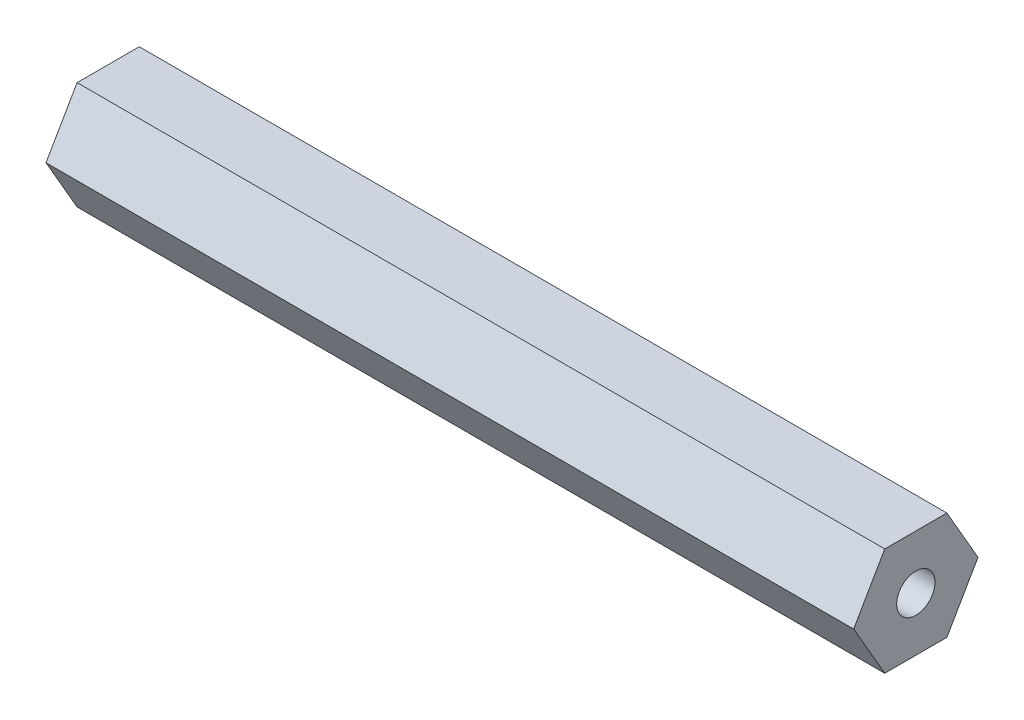
ISO-10303-21;
HEADER;
FILE_DESCRIPTION(('STEP AP214'),'2;1');
FILE_NAME('part.step','',(''),(''),'','','');
FILE_SCHEMA(('AUTOMOTIVE_DESIGN { 1 0 10303 214 1 1 1 1 }'));
ENDSEC;
DATA;
#1=APPLICATION_CONTEXT('core data for automotive mechanical design processes');
#2=APPLICATION_PROTOCOL_DEFINITION('international standard','automotive_design',2000,#1);
#3=PRODUCT_CONTEXT('',#1,'mechanical');
#4=PRODUCT('Part','Part','',(#3));
#5=PRODUCT_RELATED_PRODUCT_CATEGORY('part','',(#4));
#6=PRODUCT_DEFINITION_FORMATION('','',#4);
#7=PRODUCT_DEFINITION_CONTEXT('part definition',#1,'design');
#8=PRODUCT_DEFINITION('design','',#6,#7);
#9=PRODUCT_DEFINITION_SHAPE('','',#8);
#10=(LENGTH_UNIT() NAMED_UNIT(*) SI_UNIT(.MILLI.,.METRE.));
#11=(NAMED_UNIT(*) PLANE_ANGLE_UNIT() SI_UNIT($,.RADIAN.));
#12=(NAMED_UNIT(*) SI_UNIT($,.STERADIAN.) SOLID_ANGLE_UNIT());
#13=UNCERTAINTY_MEASURE_WITH_UNIT(LENGTH_MEASURE(1.E-05),#10,'distance_accuracy_value','');
#14=(GEOMETRIC_REPRESENTATION_CONTEXT(3) GLOBAL_UNCERTAINTY_ASSIGNED_CONTEXT((#13)) GLOBAL_UNIT_ASSIGNED_CONTEXT((#10,
#11,#12)) REPRESENTATION_CONTEXT('',''));
#15=CARTESIAN_POINT('',(0.,0.,0.));
#16=DIRECTION('',(0.,0.,1.));
#17=DIRECTION('',(1.,0.,0.));
#18=AXIS2_PLACEMENT_3D('',#15,#16,#17);
#19=CARTESIAN_POINT('',(-47.625,-3.175,-1.83308710467706));
#20=DIRECTION('',(0.,-0.5,-0.866025403784439));
#21=DIRECTION('',(0.,0.866025403784439,-0.5));
#22=AXIS2_PLACEMENT_3D('',#19,#20,#21);
#23=PLANE('',#22);
#24=DIRECTION('',(0.,0.866025403784439,-0.5));
#25=VECTOR('',#24,1.);
#26=CARTESIAN_POINT('',(0.,-3.175,-1.83308710467706));
#27=LINE('',#26,#25);
#28=CARTESIAN_POINT('',(0.,-3.175,-1.83308710467706));
#29=VERTEX_POINT('',#28);
#30=CARTESIAN_POINT('',(0.,0.,-3.66617420935412));
#31=VERTEX_POINT('',#30);
#32=EDGE_CURVE('E114',#29,#31,#27,.T.);
#33=ORIENTED_EDGE('',*,*,#32,.F.);
#34=DIRECTION('',(1.,0.,0.));
#35=VECTOR('',#34,1.);
#36=CARTESIAN_POINT('',(-47.625,-3.175,-1.83308710467706));
#37=LINE('',#36,#35);
#38=CARTESIAN_POINT('',(-47.625,-3.175,-1.83308710467706));
#39=VERTEX_POINT('',#38);
#40=EDGE_CURVE('E11',#39,#29,#37,.T.);
#41=ORIENTED_EDGE('',*,*,#40,.F.);
#42=DIRECTION('',(0.,0.866025403784439,-0.5));
#43=VECTOR('',#42,1.);
#44=CARTESIAN_POINT('',(-47.625,-3.175,-1.83308710467706));
#45=LINE('',#44,#43);
#46=CARTESIAN_POINT('',(-47.625,0.,-3.66617420935412));
#47=VERTEX_POINT('',#46);
#48=EDGE_CURVE('E132',#39,#47,#45,.T.);
#49=ORIENTED_EDGE('',*,*,#48,.T.);
#50=DIRECTION('',(1.,0.,0.));
#51=VECTOR('',#50,1.);
#52=CARTESIAN_POINT('',(-47.625,0.,-3.66617420935412));
#53=LINE('',#52,#51);
#54=EDGE_CURVE('E39',#47,#31,#53,.T.);
#55=ORIENTED_EDGE('',*,*,#54,.T.);
#56=EDGE_LOOP('',(#33,#41,#49,#55));
#57=FACE_BOUND('',#56,.T.);
#58=ADVANCED_FACE('F36',(#57),#23,.T.);
#59=CARTESIAN_POINT('',(-47.625,-3.175,1.83308710467706));
#60=DIRECTION('',(0.,-1.,0.));
#61=DIRECTION('',(0.,0.,-1.));
#62=AXIS2_PLACEMENT_3D('',#59,#60,#61);
#63=PLANE('',#62);
#64=DIRECTION('',(0.,0.,-1.));
#65=VECTOR('',#64,1.);
#66=CARTESIAN_POINT('',(0.,-3.175,1.83308710467706));
#67=LINE('',#66,#65);
#68=CARTESIAN_POINT('',(0.,-3.175,1.83308710467706));
#69=VERTEX_POINT('',#68);
#70=EDGE_CURVE('E129',#69,#29,#67,.T.);
#71=ORIENTED_EDGE('',*,*,#70,.F.);
#72=DIRECTION('',(1.,0.,0.));
#73=VECTOR('',#72,1.);
#74=CARTESIAN_POINT('',(-47.625,-3.175,1.83308710467706));
#75=LINE('',#74,#73);
#76=CARTESIAN_POINT('',(-47.625,-3.175,1.83308710467706));
#77=VERTEX_POINT('',#76);
#78=EDGE_CURVE('E44',#77,#69,#75,.T.);
#79=ORIENTED_EDGE('',*,*,#78,.F.);
#80=DIRECTION('',(0.,0.,-1.));
#81=VECTOR('',#80,1.);
#82=CARTESIAN_POINT('',(-47.625,-3.175,1.83308710467706));
#83=LINE('',#82,#81);
#84=EDGE_CURVE('E145',#77,#39,#83,.T.);
#85=ORIENTED_EDGE('',*,*,#84,.T.);
#86=ORIENTED_EDGE('',*,*,#40,.T.);
#87=EDGE_LOOP('',(#71,#79,#85,#86));
#88=FACE_BOUND('',#87,.T.);
#89=ADVANCED_FACE('F160',(#88),#63,.T.);
#90=CARTESIAN_POINT('',(-47.625,0.,3.66617420935412));
#91=DIRECTION('',(0.,-0.5,0.866025403784438));
#92=DIRECTION('',(0.,-0.866025403784439,-0.5));
#93=AXIS2_PLACEMENT_3D('',#90,#91,#92);
#94=PLANE('',#93);
#95=DIRECTION('',(0.,-0.866025403784438,-0.5));
#96=VECTOR('',#95,1.);
#97=CARTESIAN_POINT('',(0.,0.,3.66617420935412));
#98=LINE('',#97,#96);
#99=CARTESIAN_POINT('',(0.,0.,3.66617420935412));
#100=VERTEX_POINT('',#99);
#101=EDGE_CURVE('E126',#100,#69,#98,.T.);
#102=ORIENTED_EDGE('',*,*,#101,.F.);
#103=DIRECTION('',(1.,0.,0.));
#104=VECTOR('',#103,1.);
#105=CARTESIAN_POINT('',(-47.625,0.,3.66617420935412));
#106=LINE('',#105,#104);
#107=CARTESIAN_POINT('',(-47.625,0.,3.66617420935412));
#108=VERTEX_POINT('',#107);
#109=EDGE_CURVE('E148',#108,#100,#106,.T.);
#110=ORIENTED_EDGE('',*,*,#109,.F.);
#111=DIRECTION('',(0.,-0.866025403784438,-0.5));
#112=VECTOR('',#111,1.);
#113=CARTESIAN_POINT('',(-47.625,0.,3.66617420935412));
#114=LINE('',#113,#112);
#115=EDGE_CURVE('E143',#108,#77,#114,.T.);
#116=ORIENTED_EDGE('',*,*,#115,.T.);
#117=ORIENTED_EDGE('',*,*,#78,.T.);
#118=EDGE_LOOP('',(#102,#110,#116,#117));
#119=FACE_BOUND('',#118,.T.);
#120=ADVANCED_FACE('F173',(#119),#94,.T.);
#121=CARTESIAN_POINT('',(-47.625,3.175,1.83308710467706));
#122=DIRECTION('',(0.,0.5,0.866025403784438));
#123=DIRECTION('',(0.,-0.866025403784439,0.5));
#124=AXIS2_PLACEMENT_3D('',#121,#122,#123);
#125=PLANE('',#124);
#126=DIRECTION('',(0.,-0.866025403784438,0.5));
#127=VECTOR('',#126,1.);
#128=CARTESIAN_POINT('',(0.,3.175,1.83308710467706));
#129=LINE('',#128,#127);
#130=CARTESIAN_POINT('',(0.,3.175,1.83308710467706));
#131=VERTEX_POINT('',#130);
#132=EDGE_CURVE('E123',#131,#100,#129,.T.);
#133=ORIENTED_EDGE('',*,*,#132,.F.);
#134=DIRECTION('',(1.,0.,0.));
#135=VECTOR('',#134,1.);
#136=CARTESIAN_POINT('',(-47.625,3.175,1.83308710467706));
#137=LINE('',#136,#135);
#138=CARTESIAN_POINT('',(-47.625,3.175,1.83308710467706));
#139=VERTEX_POINT('',#138);
#140=EDGE_CURVE('E150',#139,#131,#137,.T.);
#141=ORIENTED_EDGE('',*,*,#140,.F.);
#142=DIRECTION('',(0.,-0.866025403784438,0.5));
#143=VECTOR('',#142,1.);
#144=CARTESIAN_POINT('',(-47.625,3.175,1.83308710467706));
#145=LINE('',#144,#143);
#146=EDGE_CURVE('E140',#139,#108,#145,.T.);
#147=ORIENTED_EDGE('',*,*,#146,.T.);
#148=ORIENTED_EDGE('',*,*,#109,.T.);
#149=EDGE_LOOP('',(#133,#141,#147,#148));
#150=FACE_BOUND('',#149,.T.);
#151=ADVANCED_FACE('F171',(#150),#125,.T.);
#152=CARTESIAN_POINT('',(-47.625,3.175,-1.83308710467706));
#153=DIRECTION('',(0.,1.,0.));
#154=DIRECTION('',(0.,0.,1.));
#155=AXIS2_PLACEMENT_3D('',#152,#153,#154);
#156=PLANE('',#155);
#157=DIRECTION('',(0.,0.,1.));
#158=VECTOR('',#157,1.);
#159=CARTESIAN_POINT('',(0.,3.175,-1.83308710467706));
#160=LINE('',#159,#158);
#161=CARTESIAN_POINT('',(0.,3.175,-1.83308710467706));
#162=VERTEX_POINT('',#161);
#163=EDGE_CURVE('E120',#162,#131,#160,.T.);
#164=ORIENTED_EDGE('',*,*,#163,.F.);
#165=DIRECTION('',(1.,0.,0.));
#166=VECTOR('',#165,1.);
#167=CARTESIAN_POINT('',(-47.625,3.175,-1.83308710467706));
#168=LINE('',#167,#166);
#169=CARTESIAN_POINT('',(-47.625,3.175,-1.83308710467706));
#170=VERTEX_POINT('',#169);
#171=EDGE_CURVE('E151',#170,#162,#168,.T.);
#172=ORIENTED_EDGE('',*,*,#171,.F.);
#173=DIRECTION('',(0.,0.,1.));
#174=VECTOR('',#173,1.);
#175=CARTESIAN_POINT('',(-47.625,3.175,-1.83308710467706));
#176=LINE('',#175,#174);
#177=EDGE_CURVE('E137',#170,#139,#176,.T.);
#178=ORIENTED_EDGE('',*,*,#177,.T.);
#179=ORIENTED_EDGE('',*,*,#140,.T.);
#180=EDGE_LOOP('',(#164,#172,#178,#179));
#181=FACE_BOUND('',#180,.T.);
#182=ADVANCED_FACE('F168',(#181),#156,.T.);
#183=CARTESIAN_POINT('',(-47.625,0.,-3.66617420935412));
#184=DIRECTION('',(0.,0.5,-0.866025403784438));
#185=DIRECTION('',(0.,0.866025403784438,0.5));
#186=AXIS2_PLACEMENT_3D('',#183,#184,#185);
#187=PLANE('',#186);
#188=DIRECTION('',(0.,0.866025403784438,0.5));
#189=VECTOR('',#188,1.);
#190=CARTESIAN_POINT('',(0.,0.,-3.66617420935412));
#191=LINE('',#190,#189);
#192=EDGE_CURVE('E117',#31,#162,#191,.T.);
#193=ORIENTED_EDGE('',*,*,#192,.F.);
#194=ORIENTED_EDGE('',*,*,#54,.F.);
#195=DIRECTION('',(0.,0.866025403784438,0.5));
#196=VECTOR('',#195,1.);
#197=CARTESIAN_POINT('',(-47.625,0.,-3.66617420935412));
#198=LINE('',#197,#196);
#199=EDGE_CURVE('E134',#47,#170,#198,.T.);
#200=ORIENTED_EDGE('',*,*,#199,.T.);
#201=ORIENTED_EDGE('',*,*,#171,.T.);
#202=EDGE_LOOP('',(#193,#194,#200,#201));
#203=FACE_BOUND('',#202,.T.);
#204=ADVANCED_FACE('F156',(#203),#187,.T.);
#205=CARTESIAN_POINT('',(-47.625,0.,-3.66617420935412));
#206=DIRECTION('',(1.,0.,0.));
#207=DIRECTION('',(0.,0.,-1.));
#208=AXIS2_PLACEMENT_3D('',#205,#206,#207);
#209=PLANE('',#208);
#210=CARTESIAN_POINT('',(-47.625,0.,0.));
#211=DIRECTION('',(-1.,0.,0.));
#212=DIRECTION('',(0.,0.,1.));
#213=AXIS2_PLACEMENT_3D('',#210,#211,#212);
#214=CIRCLE('',#213,1.13029999999999);
#215=CARTESIAN_POINT('',(-47.625,0.,1.13029999999999));
#216=VERTEX_POINT('',#215);
#217=EDGE_CURVE('E104',#216,#216,#214,.T.);
#218=ORIENTED_EDGE('',*,*,#217,.F.);
#219=EDGE_LOOP('',(#218));
#220=FACE_BOUND('',#219,.T.);
#221=ORIENTED_EDGE('',*,*,#48,.F.);
#222=ORIENTED_EDGE('',*,*,#84,.F.);
#223=ORIENTED_EDGE('',*,*,#115,.F.);
#224=ORIENTED_EDGE('',*,*,#146,.F.);
#225=ORIENTED_EDGE('',*,*,#177,.F.);
#226=ORIENTED_EDGE('',*,*,#199,.F.);
#227=EDGE_LOOP('',(#221,#222,#223,#224,#225,#226));
#228=FACE_BOUND('',#227,.T.);
#229=ADVANCED_FACE('F164',(#220,#228),#209,.F.);
#230=CARTESIAN_POINT('',(0.,0.,-3.66617420935412));
#231=DIRECTION('',(1.,0.,0.));
#232=DIRECTION('',(0.,0.,-1.));
#233=AXIS2_PLACEMENT_3D('',#230,#231,#232);
#234=PLANE('',#233);
#235=CARTESIAN_POINT('',(0.,0.,0.));
#236=DIRECTION('',(1.,0.,0.));
#237=DIRECTION('',(0.,0.,-1.));
#238=AXIS2_PLACEMENT_3D('',#235,#236,#237);
#239=CIRCLE('',#238,1.13029999999999);
#240=CARTESIAN_POINT('',(0.,0.,-1.13029999999999));
#241=VERTEX_POINT('',#240);
#242=EDGE_CURVE('E107',#241,#241,#239,.T.);
#243=ORIENTED_EDGE('',*,*,#242,.F.);
#244=EDGE_LOOP('',(#243));
#245=FACE_BOUND('',#244,.T.);
#246=ORIENTED_EDGE('',*,*,#32,.T.);
#247=ORIENTED_EDGE('',*,*,#192,.T.);
#248=ORIENTED_EDGE('',*,*,#163,.T.);
#249=ORIENTED_EDGE('',*,*,#132,.T.);
#250=ORIENTED_EDGE('',*,*,#101,.T.);
#251=ORIENTED_EDGE('',*,*,#70,.T.);
#252=EDGE_LOOP('',(#246,#247,#248,#249,#250,#251));
#253=FACE_BOUND('',#252,.T.);
#254=ADVANCED_FACE('F158',(#245,#253),#234,.T.);
#255=CARTESIAN_POINT('',(0.,0.,0.));
#256=DIRECTION('',(1.,0.,0.));
#257=DIRECTION('',(0.,0.,-1.));
#258=AXIS2_PLACEMENT_3D('',#255,#256,#257);
#259=CYLINDRICAL_SURFACE('',#258,1.13029999999999);
#260=CARTESIAN_POINT('',(-8.8646,0.,0.));
#261=DIRECTION('',(1.,0.,0.));
#262=DIRECTION('',(0.,0.,-1.));
#263=AXIS2_PLACEMENT_3D('',#260,#261,#262);
#264=CIRCLE('',#263,1.13029999999999);
#265=CARTESIAN_POINT('',(-8.8646,0.,-1.13029999999999));
#266=VERTEX_POINT('',#265);
#267=EDGE_CURVE('E103',#266,#266,#264,.T.);
#268=ORIENTED_EDGE('',*,*,#267,.F.);
#269=EDGE_LOOP('',(#268));
#270=FACE_BOUND('',#269,.T.);
#271=ORIENTED_EDGE('',*,*,#242,.T.);
#272=EDGE_LOOP('',(#271));
#273=FACE_BOUND('',#272,.T.);
#274=ADVANCED_FACE('F225',(#270,#273),#259,.F.);
#275=CARTESIAN_POINT('',(-8.8646,0.,0.));
#276=DIRECTION('',(1.,0.,0.));
#277=DIRECTION('',(0.,0.,-1.));
#278=AXIS2_PLACEMENT_3D('',#275,#276,#277);
#279=CONICAL_SURFACE('',#278,1.13029999999999,1.02974425867665);
#280=CARTESIAN_POINT('',(-9.54375275768685,0.,0.));
#281=VERTEX_POINT('',#280);
#282=VERTEX_LOOP('',#281);
#283=FACE_BOUND('',#282,.T.);
#284=ORIENTED_EDGE('',*,*,#267,.T.);
#285=EDGE_LOOP('',(#284));
#286=FACE_BOUND('',#285,.T.);
#287=ADVANCED_FACE('F97',(#283,#286),#279,.F.);
#288=CARTESIAN_POINT('',(-38.7604,0.,0.));
#289=DIRECTION('',(-1.,0.,0.));
#290=DIRECTION('',(0.,0.,1.));
#291=AXIS2_PLACEMENT_3D('',#288,#289,#290);
#292=CONICAL_SURFACE('',#291,1.13029999999999,1.02974425867665);
#293=CARTESIAN_POINT('',(-38.0812472423132,0.,0.));
#294=VERTEX_POINT('',#293);
#295=VERTEX_LOOP('',#294);
#296=FACE_BOUND('',#295,.T.);
#297=CARTESIAN_POINT('',(-38.7604,0.,0.));
#298=DIRECTION('',(-1.,0.,0.));
#299=DIRECTION('',(0.,0.,1.));
#300=AXIS2_PLACEMENT_3D('',#297,#298,#299);
#301=CIRCLE('',#300,1.13029999999999);
#302=CARTESIAN_POINT('',(-38.7604,0.,1.13029999999999));
#303=VERTEX_POINT('',#302);
#304=EDGE_CURVE('E101',#303,#303,#301,.T.);
#305=ORIENTED_EDGE('',*,*,#304,.T.);
#306=EDGE_LOOP('',(#305));
#307=FACE_BOUND('',#306,.T.);
#308=ADVANCED_FACE('F93',(#296,#307),#292,.F.);
#309=CARTESIAN_POINT('',(-47.625,0.,0.));
#310=DIRECTION('',(-1.,0.,0.));
#311=DIRECTION('',(0.,0.,1.));
#312=AXIS2_PLACEMENT_3D('',#309,#310,#311);
#313=CYLINDRICAL_SURFACE('',#312,1.13029999999999);
#314=ORIENTED_EDGE('',*,*,#304,.F.);
#315=EDGE_LOOP('',(#314));
#316=FACE_BOUND('',#315,.T.);
#317=ORIENTED_EDGE('',*,*,#217,.T.);
#318=EDGE_LOOP('',(#317));
#319=FACE_BOUND('',#318,.T.);
#320=ADVANCED_FACE('F96',(#316,#319),#313,.F.);
#321=CLOSED_SHELL('',(#58,#89,#120,#151,#182,#204,#229,#254,#274,#287,#308,#320));
#322=MANIFOLD_SOLID_BREP('B2',#321);
#323=ADVANCED_BREP_SHAPE_REPRESENTATION('',(#18,#322),#14);
#324=SHAPE_DEFINITION_REPRESENTATION(#9,#323);
ENDSEC;
END-ISO-10303-21;
